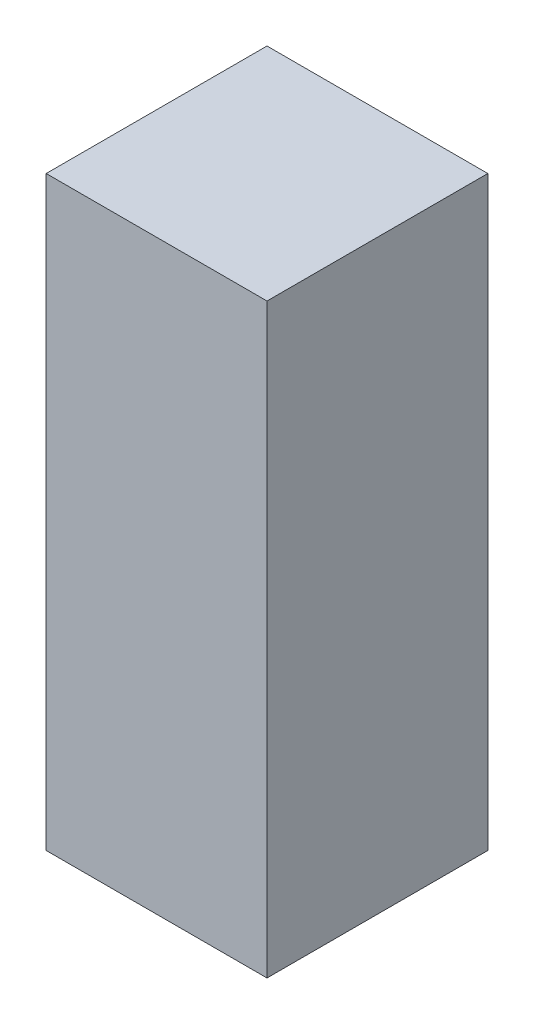
ISO-10303-21;
HEADER;
FILE_DESCRIPTION(('STEP AP214'),'2;1');
FILE_NAME('part.step','',(''),(''),'','','');
FILE_SCHEMA(('AUTOMOTIVE_DESIGN { 1 0 10303 214 1 1 1 1 }'));
ENDSEC;
DATA;
#1=APPLICATION_CONTEXT('core data for automotive mechanical design processes');
#2=APPLICATION_PROTOCOL_DEFINITION('international standard','automotive_design',2000,#1);
#3=PRODUCT_CONTEXT('',#1,'mechanical');
#4=PRODUCT('Part','Part','',(#3));
#5=PRODUCT_RELATED_PRODUCT_CATEGORY('part','',(#4));
#6=PRODUCT_DEFINITION_FORMATION('','',#4);
#7=PRODUCT_DEFINITION_CONTEXT('part definition',#1,'design');
#8=PRODUCT_DEFINITION('design','',#6,#7);
#9=PRODUCT_DEFINITION_SHAPE('','',#8);
#10=(LENGTH_UNIT() NAMED_UNIT(*) SI_UNIT(.MILLI.,.METRE.));
#11=(NAMED_UNIT(*) PLANE_ANGLE_UNIT() SI_UNIT($,.RADIAN.));
#12=(NAMED_UNIT(*) SI_UNIT($,.STERADIAN.) SOLID_ANGLE_UNIT());
#13=UNCERTAINTY_MEASURE_WITH_UNIT(LENGTH_MEASURE(1.E-05),#10,'distance_accuracy_value','');
#14=(GEOMETRIC_REPRESENTATION_CONTEXT(3) GLOBAL_UNCERTAINTY_ASSIGNED_CONTEXT((#13)) GLOBAL_UNIT_ASSIGNED_CONTEXT((#10,
#11,#12)) REPRESENTATION_CONTEXT('',''));
#15=CARTESIAN_POINT('',(0.,0.,0.));
#16=DIRECTION('',(0.,0.,1.));
#17=DIRECTION('',(1.,0.,0.));
#18=AXIS2_PLACEMENT_3D('',#15,#16,#17);
#19=CARTESIAN_POINT('',(25.4,134.874,25.4));
#20=DIRECTION('',(-1.,0.,0.));
#21=DIRECTION('',(0.,0.,1.));
#22=AXIS2_PLACEMENT_3D('',#19,#20,#21);
#23=PLANE('',#22);
#24=DIRECTION('',(0.,0.,-1.));
#25=VECTOR('',#24,1.);
#26=CARTESIAN_POINT('',(25.4,0.,25.4));
#27=LINE('',#26,#25);
#28=CARTESIAN_POINT('',(25.4,0.,25.4));
#29=VERTEX_POINT('',#28);
#30=CARTESIAN_POINT('',(25.4,0.,-25.4));
#31=VERTEX_POINT('',#30);
#32=EDGE_CURVE('E102',#29,#31,#27,.T.);
#33=ORIENTED_EDGE('',*,*,#32,.T.);
#34=DIRECTION('',(0.,-1.,0.));
#35=VECTOR('',#34,1.);
#36=CARTESIAN_POINT('',(25.4,134.874,-25.4));
#37=LINE('',#36,#35);
#38=CARTESIAN_POINT('',(25.4,134.874,-25.4));
#39=VERTEX_POINT('',#38);
#40=EDGE_CURVE('E11',#39,#31,#37,.T.);
#41=ORIENTED_EDGE('',*,*,#40,.F.);
#42=DIRECTION('',(0.,0.,-1.));
#43=VECTOR('',#42,1.);
#44=CARTESIAN_POINT('',(25.4,134.874,25.4));
#45=LINE('',#44,#43);
#46=CARTESIAN_POINT('',(25.4,134.874,25.4));
#47=VERTEX_POINT('',#46);
#48=EDGE_CURVE('E90',#47,#39,#45,.T.);
#49=ORIENTED_EDGE('',*,*,#48,.F.);
#50=DIRECTION('',(0.,-1.,0.));
#51=VECTOR('',#50,1.);
#52=CARTESIAN_POINT('',(25.4,134.874,25.4));
#53=LINE('',#52,#51);
#54=EDGE_CURVE('E98',#47,#29,#53,.T.);
#55=ORIENTED_EDGE('',*,*,#54,.T.);
#56=EDGE_LOOP('',(#33,#41,#49,#55));
#57=FACE_BOUND('',#56,.T.);
#58=ADVANCED_FACE('F39',(#57),#23,.F.);
#59=CARTESIAN_POINT('',(-25.4,134.874,-25.4));
#60=DIRECTION('',(0.,0.,1.));
#61=DIRECTION('',(1.,0.,0.));
#62=AXIS2_PLACEMENT_3D('',#59,#60,#61);
#63=PLANE('',#62);
#64=DIRECTION('',(-1.,0.,0.));
#65=VECTOR('',#64,1.);
#66=CARTESIAN_POINT('',(-25.4,0.,-25.4));
#67=LINE('',#66,#65);
#68=CARTESIAN_POINT('',(-25.4,0.,-25.4));
#69=VERTEX_POINT('',#68);
#70=EDGE_CURVE('E94',#31,#69,#67,.T.);
#71=ORIENTED_EDGE('',*,*,#70,.T.);
#72=DIRECTION('',(0.,-1.,0.));
#73=VECTOR('',#72,1.);
#74=CARTESIAN_POINT('',(-25.4,134.874,-25.4));
#75=LINE('',#74,#73);
#76=CARTESIAN_POINT('',(-25.4,134.874,-25.4));
#77=VERTEX_POINT('',#76);
#78=EDGE_CURVE('E47',#77,#69,#75,.T.);
#79=ORIENTED_EDGE('',*,*,#78,.F.);
#80=DIRECTION('',(-1.,0.,0.));
#81=VECTOR('',#80,1.);
#82=CARTESIAN_POINT('',(-25.4,134.874,-25.4));
#83=LINE('',#82,#81);
#84=EDGE_CURVE('E85',#39,#77,#83,.T.);
#85=ORIENTED_EDGE('',*,*,#84,.F.);
#86=ORIENTED_EDGE('',*,*,#40,.T.);
#87=EDGE_LOOP('',(#71,#79,#85,#86));
#88=FACE_BOUND('',#87,.T.);
#89=ADVANCED_FACE('F93',(#88),#63,.F.);
#90=CARTESIAN_POINT('',(-25.4,134.874,25.4));
#91=DIRECTION('',(1.,0.,0.));
#92=DIRECTION('',(0.,0.,-1.));
#93=AXIS2_PLACEMENT_3D('',#90,#91,#92);
#94=PLANE('',#93);
#95=DIRECTION('',(0.,0.,1.));
#96=VECTOR('',#95,1.);
#97=CARTESIAN_POINT('',(-25.4,0.,25.4));
#98=LINE('',#97,#96);
#99=CARTESIAN_POINT('',(-25.4,0.,25.4));
#100=VERTEX_POINT('',#99);
#101=EDGE_CURVE('E72',#69,#100,#98,.T.);
#102=ORIENTED_EDGE('',*,*,#101,.T.);
#103=DIRECTION('',(0.,-1.,0.));
#104=VECTOR('',#103,1.);
#105=CARTESIAN_POINT('',(-25.4,134.874,25.4));
#106=LINE('',#105,#104);
#107=CARTESIAN_POINT('',(-25.4,134.874,25.4));
#108=VERTEX_POINT('',#107);
#109=EDGE_CURVE('E95',#108,#100,#106,.T.);
#110=ORIENTED_EDGE('',*,*,#109,.F.);
#111=DIRECTION('',(0.,0.,1.));
#112=VECTOR('',#111,1.);
#113=CARTESIAN_POINT('',(-25.4,134.874,25.4));
#114=LINE('',#113,#112);
#115=EDGE_CURVE('E88',#77,#108,#114,.T.);
#116=ORIENTED_EDGE('',*,*,#115,.F.);
#117=ORIENTED_EDGE('',*,*,#78,.T.);
#118=EDGE_LOOP('',(#102,#110,#116,#117));
#119=FACE_BOUND('',#118,.T.);
#120=ADVANCED_FACE('F96',(#119),#94,.F.);
#121=CARTESIAN_POINT('',(-25.4,134.874,25.4));
#122=DIRECTION('',(0.,0.,-1.));
#123=DIRECTION('',(-1.,0.,0.));
#124=AXIS2_PLACEMENT_3D('',#121,#122,#123);
#125=PLANE('',#124);
#126=DIRECTION('',(1.,0.,0.));
#127=VECTOR('',#126,1.);
#128=CARTESIAN_POINT('',(-25.4,0.,25.4));
#129=LINE('',#128,#127);
#130=EDGE_CURVE('E78',#100,#29,#129,.T.);
#131=ORIENTED_EDGE('',*,*,#130,.T.);
#132=ORIENTED_EDGE('',*,*,#54,.F.);
#133=DIRECTION('',(1.,0.,0.));
#134=VECTOR('',#133,1.);
#135=CARTESIAN_POINT('',(-25.4,134.874,25.4));
#136=LINE('',#135,#134);
#137=EDGE_CURVE('E55',#108,#47,#136,.T.);
#138=ORIENTED_EDGE('',*,*,#137,.F.);
#139=ORIENTED_EDGE('',*,*,#109,.T.);
#140=EDGE_LOOP('',(#131,#132,#138,#139));
#141=FACE_BOUND('',#140,.T.);
#142=ADVANCED_FACE('F109',(#141),#125,.F.);
#143=CARTESIAN_POINT('',(0.,134.874,0.));
#144=DIRECTION('',(0.,-1.,0.));
#145=DIRECTION('',(0.,0.,-1.));
#146=AXIS2_PLACEMENT_3D('',#143,#144,#145);
#147=PLANE('',#146);
#148=ORIENTED_EDGE('',*,*,#48,.T.);
#149=ORIENTED_EDGE('',*,*,#84,.T.);
#150=ORIENTED_EDGE('',*,*,#115,.T.);
#151=ORIENTED_EDGE('',*,*,#137,.T.);
#152=EDGE_LOOP('',(#148,#149,#150,#151));
#153=FACE_BOUND('',#152,.T.);
#154=ADVANCED_FACE('F86',(#153),#147,.F.);
#155=CARTESIAN_POINT('',(0.,0.,0.));
#156=DIRECTION('',(0.,-1.,0.));
#157=DIRECTION('',(0.,0.,-1.));
#158=AXIS2_PLACEMENT_3D('',#155,#156,#157);
#159=PLANE('',#158);
#160=ORIENTED_EDGE('',*,*,#32,.F.);
#161=ORIENTED_EDGE('',*,*,#130,.F.);
#162=ORIENTED_EDGE('',*,*,#101,.F.);
#163=ORIENTED_EDGE('',*,*,#70,.F.);
#164=EDGE_LOOP('',(#160,#161,#162,#163));
#165=FACE_BOUND('',#164,.T.);
#166=ADVANCED_FACE('F112',(#165),#159,.T.);
#167=CLOSED_SHELL('',(#58,#89,#120,#142,#154,#166));
#168=MANIFOLD_SOLID_BREP('B2',#167);
#169=ADVANCED_BREP_SHAPE_REPRESENTATION('',(#18,#168),#14);
#170=SHAPE_DEFINITION_REPRESENTATION(#9,#169);
ENDSEC;
END-ISO-10303-21;
